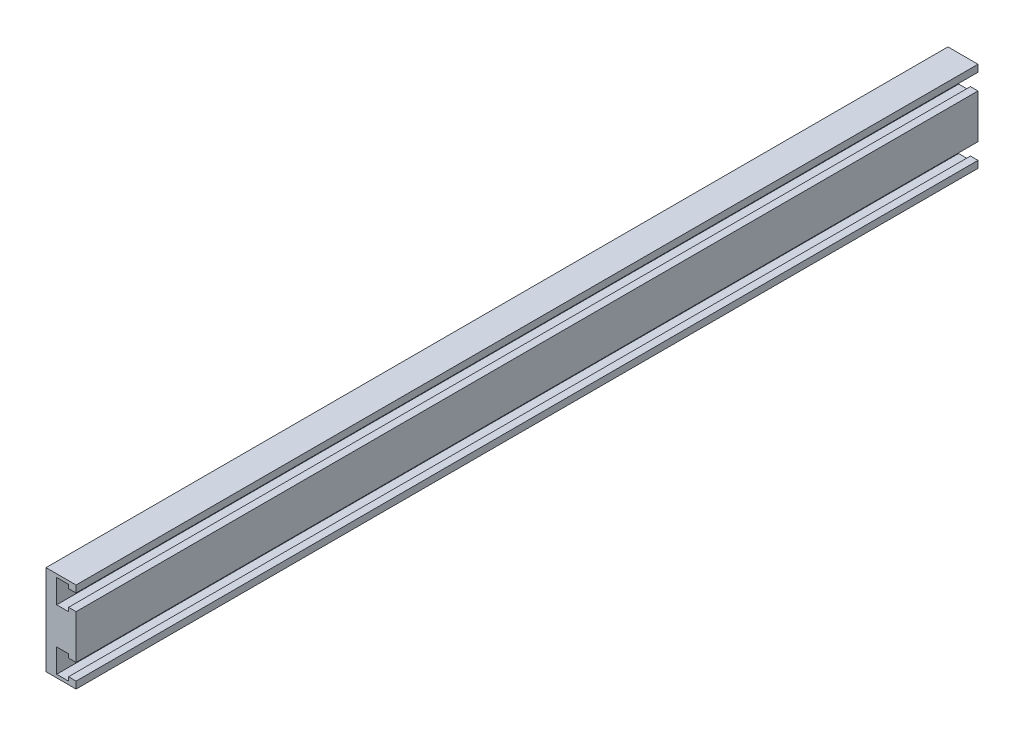
ISO-10303-21;
HEADER;
FILE_DESCRIPTION(('STEP AP214'),'2;1');
FILE_NAME('part.step','',(''),(''),'','','');
FILE_SCHEMA(('AUTOMOTIVE_DESIGN { 1 0 10303 214 1 1 1 1 }'));
ENDSEC;
DATA;
#1=APPLICATION_CONTEXT('core data for automotive mechanical design processes');
#2=APPLICATION_PROTOCOL_DEFINITION('international standard','automotive_design',2000,#1);
#3=PRODUCT_CONTEXT('',#1,'mechanical');
#4=PRODUCT('Part','Part','',(#3));
#5=PRODUCT_RELATED_PRODUCT_CATEGORY('part','',(#4));
#6=PRODUCT_DEFINITION_FORMATION('','',#4);
#7=PRODUCT_DEFINITION_CONTEXT('part definition',#1,'design');
#8=PRODUCT_DEFINITION('design','',#6,#7);
#9=PRODUCT_DEFINITION_SHAPE('','',#8);
#10=(LENGTH_UNIT() NAMED_UNIT(*) SI_UNIT(.MILLI.,.METRE.));
#11=(NAMED_UNIT(*) PLANE_ANGLE_UNIT() SI_UNIT($,.RADIAN.));
#12=(NAMED_UNIT(*) SI_UNIT($,.STERADIAN.) SOLID_ANGLE_UNIT());
#13=UNCERTAINTY_MEASURE_WITH_UNIT(LENGTH_MEASURE(1.E-05),#10,'distance_accuracy_value','');
#14=(GEOMETRIC_REPRESENTATION_CONTEXT(3) GLOBAL_UNCERTAINTY_ASSIGNED_CONTEXT((#13)) GLOBAL_UNIT_ASSIGNED_CONTEXT((#10,
#11,#12)) REPRESENTATION_CONTEXT('',''));
#15=CARTESIAN_POINT('',(0.,0.,0.));
#16=DIRECTION('',(0.,0.,1.));
#17=DIRECTION('',(1.,0.,0.));
#18=AXIS2_PLACEMENT_3D('',#15,#16,#17);
#19=CARTESIAN_POINT('',(-6.35,-19.05,-190.5));
#20=DIRECTION('',(0.,-1.,0.));
#21=DIRECTION('',(0.,0.,-1.));
#22=AXIS2_PLACEMENT_3D('',#19,#20,#21);
#23=PLANE('',#22);
#24=DIRECTION('',(0.,0.,1.));
#25=VECTOR('',#24,1.);
#26=CARTESIAN_POINT('',(6.35,-19.05,-190.5));
#27=LINE('',#26,#25);
#28=CARTESIAN_POINT('',(6.35,-19.05,-190.5));
#29=VERTEX_POINT('',#28);
#30=CARTESIAN_POINT('',(6.35,-19.05,190.5));
#31=VERTEX_POINT('',#30);
#32=EDGE_CURVE('E46',#29,#31,#27,.T.);
#33=ORIENTED_EDGE('',*,*,#32,.T.);
#34=DIRECTION('',(1.,0.,0.));
#35=VECTOR('',#34,1.);
#36=CARTESIAN_POINT('',(-6.35,-19.05,190.5));
#37=LINE('',#36,#35);
#38=CARTESIAN_POINT('',(-6.35,-19.05,190.5));
#39=VERTEX_POINT('',#38);
#40=EDGE_CURVE('E179',#39,#31,#37,.T.);
#41=ORIENTED_EDGE('',*,*,#40,.F.);
#42=DIRECTION('',(0.,0.,1.));
#43=VECTOR('',#42,1.);
#44=CARTESIAN_POINT('',(-6.35,-19.05,-190.5));
#45=LINE('',#44,#43);
#46=CARTESIAN_POINT('',(-6.35,-19.05,-190.5));
#47=VERTEX_POINT('',#46);
#48=EDGE_CURVE('E11',#47,#39,#45,.T.);
#49=ORIENTED_EDGE('',*,*,#48,.F.);
#50=DIRECTION('',(1.,0.,0.));
#51=VECTOR('',#50,1.);
#52=CARTESIAN_POINT('',(-6.35,-19.05,-190.5));
#53=LINE('',#52,#51);
#54=EDGE_CURVE('E181',#47,#29,#53,.T.);
#55=ORIENTED_EDGE('',*,*,#54,.T.);
#56=EDGE_LOOP('',(#33,#41,#49,#55));
#57=FACE_BOUND('',#56,.T.);
#58=ADVANCED_FACE('F43',(#57),#23,.T.);
#59=CARTESIAN_POINT('',(-6.35,-19.05,-190.5));
#60=DIRECTION('',(1.,0.,0.));
#61=DIRECTION('',(0.,0.,-1.));
#62=AXIS2_PLACEMENT_3D('',#59,#60,#61);
#63=PLANE('',#62);
#64=ORIENTED_EDGE('',*,*,#48,.T.);
#65=DIRECTION('',(0.,1.,0.));
#66=VECTOR('',#65,1.);
#67=CARTESIAN_POINT('',(-6.35,-19.05,190.5));
#68=LINE('',#67,#66);
#69=CARTESIAN_POINT('',(-6.35,19.05,190.5));
#70=VERTEX_POINT('',#69);
#71=EDGE_CURVE('E193',#39,#70,#68,.T.);
#72=ORIENTED_EDGE('',*,*,#71,.T.);
#73=DIRECTION('',(0.,0.,1.));
#74=VECTOR('',#73,1.);
#75=CARTESIAN_POINT('',(-6.35,19.05,-190.5));
#76=LINE('',#75,#74);
#77=CARTESIAN_POINT('',(-6.35,19.05,-190.5));
#78=VERTEX_POINT('',#77);
#79=EDGE_CURVE('E51',#78,#70,#76,.T.);
#80=ORIENTED_EDGE('',*,*,#79,.F.);
#81=DIRECTION('',(0.,1.,0.));
#82=VECTOR('',#81,1.);
#83=CARTESIAN_POINT('',(-6.35,-19.05,-190.5));
#84=LINE('',#83,#82);
#85=EDGE_CURVE('E64',#47,#78,#84,.T.);
#86=ORIENTED_EDGE('',*,*,#85,.F.);
#87=EDGE_LOOP('',(#64,#72,#80,#86));
#88=FACE_BOUND('',#87,.T.);
#89=ADVANCED_FACE('F404',(#88),#63,.F.);
#90=CARTESIAN_POINT('',(-6.35,19.05,-190.5));
#91=DIRECTION('',(0.,-1.,0.));
#92=DIRECTION('',(0.,0.,-1.));
#93=AXIS2_PLACEMENT_3D('',#90,#91,#92);
#94=PLANE('',#93);
#95=ORIENTED_EDGE('',*,*,#79,.T.);
#96=DIRECTION('',(1.,0.,0.));
#97=VECTOR('',#96,1.);
#98=CARTESIAN_POINT('',(-6.35,19.05,190.5));
#99=LINE('',#98,#97);
#100=CARTESIAN_POINT('',(6.35,19.05,190.5));
#101=VERTEX_POINT('',#100);
#102=EDGE_CURVE('E246',#70,#101,#99,.T.);
#103=ORIENTED_EDGE('',*,*,#102,.T.);
#104=DIRECTION('',(0.,0.,1.));
#105=VECTOR('',#104,1.);
#106=CARTESIAN_POINT('',(6.35,19.05,-190.5));
#107=LINE('',#106,#105);
#108=CARTESIAN_POINT('',(6.35,19.05,-190.5));
#109=VERTEX_POINT('',#108);
#110=EDGE_CURVE('E297',#109,#101,#107,.T.);
#111=ORIENTED_EDGE('',*,*,#110,.F.);
#112=DIRECTION('',(1.,0.,0.));
#113=VECTOR('',#112,1.);
#114=CARTESIAN_POINT('',(-6.35,19.05,-190.5));
#115=LINE('',#114,#113);
#116=EDGE_CURVE('E293',#78,#109,#115,.T.);
#117=ORIENTED_EDGE('',*,*,#116,.F.);
#118=EDGE_LOOP('',(#95,#103,#111,#117));
#119=FACE_BOUND('',#118,.T.);
#120=ADVANCED_FACE('F401',(#119),#94,.F.);
#121=CARTESIAN_POINT('',(6.35,16.1125,-190.5));
#122=DIRECTION('',(1.,0.,0.));
#123=DIRECTION('',(0.,1.,0.));
#124=AXIS2_PLACEMENT_3D('',#121,#122,#123);
#125=PLANE('',#124);
#126=ORIENTED_EDGE('',*,*,#110,.T.);
#127=DIRECTION('',(0.,1.,0.));
#128=VECTOR('',#127,1.);
#129=CARTESIAN_POINT('',(6.35,16.1125,190.5));
#130=LINE('',#129,#128);
#131=CARTESIAN_POINT('',(6.35,16.1125,190.5));
#132=VERTEX_POINT('',#131);
#133=EDGE_CURVE('E243',#132,#101,#130,.T.);
#134=ORIENTED_EDGE('',*,*,#133,.F.);
#135=DIRECTION('',(0.,0.,1.));
#136=VECTOR('',#135,1.);
#137=CARTESIAN_POINT('',(6.35,16.1125,-190.5));
#138=LINE('',#137,#136);
#139=CARTESIAN_POINT('',(6.35,16.1125,-190.5));
#140=VERTEX_POINT('',#139);
#141=EDGE_CURVE('E299',#140,#132,#138,.T.);
#142=ORIENTED_EDGE('',*,*,#141,.F.);
#143=DIRECTION('',(0.,1.,0.));
#144=VECTOR('',#143,1.);
#145=CARTESIAN_POINT('',(6.35,16.1125,-190.5));
#146=LINE('',#145,#144);
#147=EDGE_CURVE('E290',#140,#109,#146,.T.);
#148=ORIENTED_EDGE('',*,*,#147,.T.);
#149=EDGE_LOOP('',(#126,#134,#142,#148));
#150=FACE_BOUND('',#149,.T.);
#151=ADVANCED_FACE('F411',(#150),#125,.T.);
#152=CARTESIAN_POINT('',(6.35,16.1125,-190.5));
#153=DIRECTION('',(0.,1.,0.));
#154=DIRECTION('',(0.,0.,1.));
#155=AXIS2_PLACEMENT_3D('',#152,#153,#154);
#156=PLANE('',#155);
#157=ORIENTED_EDGE('',*,*,#141,.T.);
#158=DIRECTION('',(-1.,0.,0.));
#159=VECTOR('',#158,1.);
#160=CARTESIAN_POINT('',(6.35,16.1125,190.5));
#161=LINE('',#160,#159);
#162=CARTESIAN_POINT('',(3.175,16.1125,190.5));
#163=VERTEX_POINT('',#162);
#164=EDGE_CURVE('E240',#132,#163,#161,.T.);
#165=ORIENTED_EDGE('',*,*,#164,.T.);
#166=DIRECTION('',(0.,0.,1.));
#167=VECTOR('',#166,1.);
#168=CARTESIAN_POINT('',(3.175,16.1125,-190.5));
#169=LINE('',#168,#167);
#170=CARTESIAN_POINT('',(3.175,16.1125,-190.5));
#171=VERTEX_POINT('',#170);
#172=EDGE_CURVE('E301',#171,#163,#169,.T.);
#173=ORIENTED_EDGE('',*,*,#172,.F.);
#174=DIRECTION('',(-1.,0.,0.));
#175=VECTOR('',#174,1.);
#176=CARTESIAN_POINT('',(6.35,16.1125,-190.5));
#177=LINE('',#176,#175);
#178=EDGE_CURVE('E288',#140,#171,#177,.T.);
#179=ORIENTED_EDGE('',*,*,#178,.F.);
#180=EDGE_LOOP('',(#157,#165,#173,#179));
#181=FACE_BOUND('',#180,.T.);
#182=ADVANCED_FACE('F395',(#181),#156,.F.);
#183=CARTESIAN_POINT('',(3.175,16.1125,-190.5));
#184=DIRECTION('',(1.,0.,0.));
#185=DIRECTION('',(0.,0.,-1.));
#186=AXIS2_PLACEMENT_3D('',#183,#184,#185);
#187=PLANE('',#186);
#188=ORIENTED_EDGE('',*,*,#172,.T.);
#189=DIRECTION('',(0.,1.,0.));
#190=VECTOR('',#189,1.);
#191=CARTESIAN_POINT('',(3.175,16.1125,190.5));
#192=LINE('',#191,#190);
#193=CARTESIAN_POINT('',(3.175,17.7,190.5));
#194=VERTEX_POINT('',#193);
#195=EDGE_CURVE('E237',#163,#194,#192,.T.);
#196=ORIENTED_EDGE('',*,*,#195,.T.);
#197=DIRECTION('',(0.,0.,1.));
#198=VECTOR('',#197,1.);
#199=CARTESIAN_POINT('',(3.175,17.7,-190.5));
#200=LINE('',#199,#198);
#201=CARTESIAN_POINT('',(3.175,17.7,-190.5));
#202=VERTEX_POINT('',#201);
#203=EDGE_CURVE('E303',#202,#194,#200,.T.);
#204=ORIENTED_EDGE('',*,*,#203,.F.);
#205=DIRECTION('',(0.,1.,0.));
#206=VECTOR('',#205,1.);
#207=CARTESIAN_POINT('',(3.175,16.1125,-190.5));
#208=LINE('',#207,#206);
#209=EDGE_CURVE('E286',#171,#202,#208,.T.);
#210=ORIENTED_EDGE('',*,*,#209,.F.);
#211=EDGE_LOOP('',(#188,#196,#204,#210));
#212=FACE_BOUND('',#211,.T.);
#213=ADVANCED_FACE('F390',(#212),#187,.F.);
#214=CARTESIAN_POINT('',(3.175,17.7,-190.5));
#215=DIRECTION('',(0.,1.,0.));
#216=DIRECTION('',(0.,0.,1.));
#217=AXIS2_PLACEMENT_3D('',#214,#215,#216);
#218=PLANE('',#217);
#219=ORIENTED_EDGE('',*,*,#203,.T.);
#220=DIRECTION('',(-1.,0.,0.));
#221=VECTOR('',#220,1.);
#222=CARTESIAN_POINT('',(3.175,17.7,190.5));
#223=LINE('',#222,#221);
#224=CARTESIAN_POINT('',(-1.825,17.7,190.5));
#225=VERTEX_POINT('',#224);
#226=EDGE_CURVE('E234',#194,#225,#223,.T.);
#227=ORIENTED_EDGE('',*,*,#226,.T.);
#228=DIRECTION('',(0.,0.,1.));
#229=VECTOR('',#228,1.);
#230=CARTESIAN_POINT('',(-1.825,17.7,-190.5));
#231=LINE('',#230,#229);
#232=CARTESIAN_POINT('',(-1.825,17.7,-190.5));
#233=VERTEX_POINT('',#232);
#234=EDGE_CURVE('E305',#233,#225,#231,.T.);
#235=ORIENTED_EDGE('',*,*,#234,.F.);
#236=DIRECTION('',(-1.,0.,0.));
#237=VECTOR('',#236,1.);
#238=CARTESIAN_POINT('',(3.175,17.7,-190.5));
#239=LINE('',#238,#237);
#240=EDGE_CURVE('E284',#202,#233,#239,.T.);
#241=ORIENTED_EDGE('',*,*,#240,.F.);
#242=EDGE_LOOP('',(#219,#227,#235,#241));
#243=FACE_BOUND('',#242,.T.);
#244=ADVANCED_FACE('F385',(#243),#218,.F.);
#245=CARTESIAN_POINT('',(-1.825,17.7,-190.5));
#246=DIRECTION('',(-1.,0.,0.));
#247=DIRECTION('',(0.,0.,1.));
#248=AXIS2_PLACEMENT_3D('',#245,#246,#247);
#249=PLANE('',#248);
#250=ORIENTED_EDGE('',*,*,#234,.T.);
#251=DIRECTION('',(0.,-1.,0.));
#252=VECTOR('',#251,1.);
#253=CARTESIAN_POINT('',(-1.825,17.7,190.5));
#254=LINE('',#253,#252);
#255=CARTESIAN_POINT('',(-1.825,7.7,190.5));
#256=VERTEX_POINT('',#255);
#257=EDGE_CURVE('E231',#225,#256,#254,.T.);
#258=ORIENTED_EDGE('',*,*,#257,.T.);
#259=DIRECTION('',(0.,0.,1.));
#260=VECTOR('',#259,1.);
#261=CARTESIAN_POINT('',(-1.825,7.7,-190.5));
#262=LINE('',#261,#260);
#263=CARTESIAN_POINT('',(-1.825,7.7,-190.5));
#264=VERTEX_POINT('',#263);
#265=EDGE_CURVE('E307',#264,#256,#262,.T.);
#266=ORIENTED_EDGE('',*,*,#265,.F.);
#267=DIRECTION('',(0.,-1.,0.));
#268=VECTOR('',#267,1.);
#269=CARTESIAN_POINT('',(-1.825,17.7,-190.5));
#270=LINE('',#269,#268);
#271=EDGE_CURVE('E282',#233,#264,#270,.T.);
#272=ORIENTED_EDGE('',*,*,#271,.F.);
#273=EDGE_LOOP('',(#250,#258,#266,#272));
#274=FACE_BOUND('',#273,.T.);
#275=ADVANCED_FACE('F380',(#274),#249,.F.);
#276=CARTESIAN_POINT('',(-1.825,7.7,-190.5));
#277=DIRECTION('',(0.,-1.,0.));
#278=DIRECTION('',(0.,0.,-1.));
#279=AXIS2_PLACEMENT_3D('',#276,#277,#278);
#280=PLANE('',#279);
#281=ORIENTED_EDGE('',*,*,#265,.T.);
#282=DIRECTION('',(1.,0.,0.));
#283=VECTOR('',#282,1.);
#284=CARTESIAN_POINT('',(-1.825,7.7,190.5));
#285=LINE('',#284,#283);
#286=CARTESIAN_POINT('',(3.175,7.7,190.5));
#287=VERTEX_POINT('',#286);
#288=EDGE_CURVE('E228',#256,#287,#285,.T.);
#289=ORIENTED_EDGE('',*,*,#288,.T.);
#290=DIRECTION('',(0.,0.,1.));
#291=VECTOR('',#290,1.);
#292=CARTESIAN_POINT('',(3.175,7.7,-190.5));
#293=LINE('',#292,#291);
#294=CARTESIAN_POINT('',(3.175,7.7,-190.5));
#295=VERTEX_POINT('',#294);
#296=EDGE_CURVE('E309',#295,#287,#293,.T.);
#297=ORIENTED_EDGE('',*,*,#296,.F.);
#298=DIRECTION('',(1.,0.,0.));
#299=VECTOR('',#298,1.);
#300=CARTESIAN_POINT('',(-1.825,7.7,-190.5));
#301=LINE('',#300,#299);
#302=EDGE_CURVE('E280',#264,#295,#301,.T.);
#303=ORIENTED_EDGE('',*,*,#302,.F.);
#304=EDGE_LOOP('',(#281,#289,#297,#303));
#305=FACE_BOUND('',#304,.T.);
#306=ADVANCED_FACE('F375',(#305),#280,.F.);
#307=CARTESIAN_POINT('',(3.175,7.7,-190.5));
#308=DIRECTION('',(1.,0.,0.));
#309=DIRECTION('',(0.,0.,-1.));
#310=AXIS2_PLACEMENT_3D('',#307,#308,#309);
#311=PLANE('',#310);
#312=ORIENTED_EDGE('',*,*,#296,.T.);
#313=DIRECTION('',(0.,1.,0.));
#314=VECTOR('',#313,1.);
#315=CARTESIAN_POINT('',(3.175,7.7,190.5));
#316=LINE('',#315,#314);
#317=CARTESIAN_POINT('',(3.175,9.2875,190.5));
#318=VERTEX_POINT('',#317);
#319=EDGE_CURVE('E225',#287,#318,#316,.T.);
#320=ORIENTED_EDGE('',*,*,#319,.T.);
#321=DIRECTION('',(0.,0.,1.));
#322=VECTOR('',#321,1.);
#323=CARTESIAN_POINT('',(3.175,9.2875,-190.5));
#324=LINE('',#323,#322);
#325=CARTESIAN_POINT('',(3.175,9.2875,-190.5));
#326=VERTEX_POINT('',#325);
#327=EDGE_CURVE('E311',#326,#318,#324,.T.);
#328=ORIENTED_EDGE('',*,*,#327,.F.);
#329=DIRECTION('',(0.,1.,0.));
#330=VECTOR('',#329,1.);
#331=CARTESIAN_POINT('',(3.175,7.7,-190.5));
#332=LINE('',#331,#330);
#333=EDGE_CURVE('E278',#295,#326,#332,.T.);
#334=ORIENTED_EDGE('',*,*,#333,.F.);
#335=EDGE_LOOP('',(#312,#320,#328,#334));
#336=FACE_BOUND('',#335,.T.);
#337=ADVANCED_FACE('F370',(#336),#311,.F.);
#338=CARTESIAN_POINT('',(3.175,9.2875,-190.5));
#339=DIRECTION('',(0.,-1.,0.));
#340=DIRECTION('',(0.,0.,-1.));
#341=AXIS2_PLACEMENT_3D('',#338,#339,#340);
#342=PLANE('',#341);
#343=ORIENTED_EDGE('',*,*,#327,.T.);
#344=DIRECTION('',(1.,0.,0.));
#345=VECTOR('',#344,1.);
#346=CARTESIAN_POINT('',(3.175,9.2875,190.5));
#347=LINE('',#346,#345);
#348=CARTESIAN_POINT('',(6.34999999999999,9.2875,190.5));
#349=VERTEX_POINT('',#348);
#350=EDGE_CURVE('E222',#318,#349,#347,.T.);
#351=ORIENTED_EDGE('',*,*,#350,.T.);
#352=DIRECTION('',(0.,0.,1.));
#353=VECTOR('',#352,1.);
#354=CARTESIAN_POINT('',(6.34999999999999,9.2875,-190.5));
#355=LINE('',#354,#353);
#356=CARTESIAN_POINT('',(6.34999999999999,9.2875,-190.5));
#357=VERTEX_POINT('',#356);
#358=EDGE_CURVE('E313',#357,#349,#355,.T.);
#359=ORIENTED_EDGE('',*,*,#358,.F.);
#360=DIRECTION('',(1.,0.,0.));
#361=VECTOR('',#360,1.);
#362=CARTESIAN_POINT('',(3.175,9.2875,-190.5));
#363=LINE('',#362,#361);
#364=EDGE_CURVE('E276',#326,#357,#363,.T.);
#365=ORIENTED_EDGE('',*,*,#364,.F.);
#366=EDGE_LOOP('',(#343,#351,#359,#365));
#367=FACE_BOUND('',#366,.T.);
#368=ADVANCED_FACE('F365',(#367),#342,.F.);
#369=CARTESIAN_POINT('',(6.34999999999999,9.2875,-190.5));
#370=DIRECTION('',(-1.,0.,0.));
#371=DIRECTION('',(0.,0.,1.));
#372=AXIS2_PLACEMENT_3D('',#369,#370,#371);
#373=PLANE('',#372);
#374=ORIENTED_EDGE('',*,*,#358,.T.);
#375=DIRECTION('',(0.,-1.,0.));
#376=VECTOR('',#375,1.);
#377=CARTESIAN_POINT('',(6.34999999999999,9.2875,190.5));
#378=LINE('',#377,#376);
#379=CARTESIAN_POINT('',(6.34999999999999,-9.2875,190.5));
#380=VERTEX_POINT('',#379);
#381=EDGE_CURVE('E219',#349,#380,#378,.T.);
#382=ORIENTED_EDGE('',*,*,#381,.T.);
#383=DIRECTION('',(0.,0.,1.));
#384=VECTOR('',#383,1.);
#385=CARTESIAN_POINT('',(6.34999999999999,-9.2875,-190.5));
#386=LINE('',#385,#384);
#387=CARTESIAN_POINT('',(6.34999999999999,-9.2875,-190.5));
#388=VERTEX_POINT('',#387);
#389=EDGE_CURVE('E315',#388,#380,#386,.T.);
#390=ORIENTED_EDGE('',*,*,#389,.F.);
#391=DIRECTION('',(0.,-1.,0.));
#392=VECTOR('',#391,1.);
#393=CARTESIAN_POINT('',(6.34999999999999,9.2875,-190.5));
#394=LINE('',#393,#392);
#395=EDGE_CURVE('E274',#357,#388,#394,.T.);
#396=ORIENTED_EDGE('',*,*,#395,.F.);
#397=EDGE_LOOP('',(#374,#382,#390,#396));
#398=FACE_BOUND('',#397,.T.);
#399=ADVANCED_FACE('F361',(#398),#373,.F.);
#400=CARTESIAN_POINT('',(3.175,-9.2875,-190.5));
#401=DIRECTION('',(0.,-1.,0.));
#402=DIRECTION('',(0.,0.,-1.));
#403=AXIS2_PLACEMENT_3D('',#400,#401,#402);
#404=PLANE('',#403);
#405=ORIENTED_EDGE('',*,*,#389,.T.);
#406=DIRECTION('',(1.,0.,0.));
#407=VECTOR('',#406,1.);
#408=CARTESIAN_POINT('',(3.175,-9.2875,190.5));
#409=LINE('',#408,#407);
#410=CARTESIAN_POINT('',(3.175,-9.2875,190.5));
#411=VERTEX_POINT('',#410);
#412=EDGE_CURVE('E216',#411,#380,#409,.T.);
#413=ORIENTED_EDGE('',*,*,#412,.F.);
#414=DIRECTION('',(0.,0.,1.));
#415=VECTOR('',#414,1.);
#416=CARTESIAN_POINT('',(3.175,-9.2875,-190.5));
#417=LINE('',#416,#415);
#418=CARTESIAN_POINT('',(3.175,-9.2875,-190.5));
#419=VERTEX_POINT('',#418);
#420=EDGE_CURVE('E317',#419,#411,#417,.T.);
#421=ORIENTED_EDGE('',*,*,#420,.F.);
#422=DIRECTION('',(1.,0.,0.));
#423=VECTOR('',#422,1.);
#424=CARTESIAN_POINT('',(3.175,-9.2875,-190.5));
#425=LINE('',#424,#423);
#426=EDGE_CURVE('E271',#419,#388,#425,.T.);
#427=ORIENTED_EDGE('',*,*,#426,.T.);
#428=EDGE_LOOP('',(#405,#413,#421,#427));
#429=FACE_BOUND('',#428,.T.);
#430=ADVANCED_FACE('F356',(#429),#404,.T.);
#431=CARTESIAN_POINT('',(3.175,-7.7,-190.5));
#432=DIRECTION('',(-1.,0.,0.));
#433=DIRECTION('',(0.,0.,1.));
#434=AXIS2_PLACEMENT_3D('',#431,#432,#433);
#435=PLANE('',#434);
#436=ORIENTED_EDGE('',*,*,#420,.T.);
#437=DIRECTION('',(0.,-1.,0.));
#438=VECTOR('',#437,1.);
#439=CARTESIAN_POINT('',(3.175,-7.7,190.5));
#440=LINE('',#439,#438);
#441=CARTESIAN_POINT('',(3.175,-7.7,190.5));
#442=VERTEX_POINT('',#441);
#443=EDGE_CURVE('E213',#442,#411,#440,.T.);
#444=ORIENTED_EDGE('',*,*,#443,.F.);
#445=DIRECTION('',(0.,0.,1.));
#446=VECTOR('',#445,1.);
#447=CARTESIAN_POINT('',(3.175,-7.7,-190.5));
#448=LINE('',#447,#446);
#449=CARTESIAN_POINT('',(3.175,-7.7,-190.5));
#450=VERTEX_POINT('',#449);
#451=EDGE_CURVE('E319',#450,#442,#448,.T.);
#452=ORIENTED_EDGE('',*,*,#451,.F.);
#453=DIRECTION('',(0.,-1.,0.));
#454=VECTOR('',#453,1.);
#455=CARTESIAN_POINT('',(3.175,-7.7,-190.5));
#456=LINE('',#455,#454);
#457=EDGE_CURVE('E268',#450,#419,#456,.T.);
#458=ORIENTED_EDGE('',*,*,#457,.T.);
#459=EDGE_LOOP('',(#436,#444,#452,#458));
#460=FACE_BOUND('',#459,.T.);
#461=ADVANCED_FACE('F351',(#460),#435,.T.);
#462=CARTESIAN_POINT('',(-1.825,-7.7,-190.5));
#463=DIRECTION('',(0.,-1.,0.));
#464=DIRECTION('',(1.,0.,0.));
#465=AXIS2_PLACEMENT_3D('',#462,#463,#464);
#466=PLANE('',#465);
#467=ORIENTED_EDGE('',*,*,#451,.T.);
#468=DIRECTION('',(1.,0.,0.));
#469=VECTOR('',#468,1.);
#470=CARTESIAN_POINT('',(-1.825,-7.7,190.5));
#471=LINE('',#470,#469);
#472=CARTESIAN_POINT('',(-1.825,-7.7,190.5));
#473=VERTEX_POINT('',#472);
#474=EDGE_CURVE('E210',#473,#442,#471,.T.);
#475=ORIENTED_EDGE('',*,*,#474,.F.);
#476=DIRECTION('',(0.,0.,1.));
#477=VECTOR('',#476,1.);
#478=CARTESIAN_POINT('',(-1.825,-7.7,-190.5));
#479=LINE('',#478,#477);
#480=CARTESIAN_POINT('',(-1.825,-7.7,-190.5));
#481=VERTEX_POINT('',#480);
#482=EDGE_CURVE('E321',#481,#473,#479,.T.);
#483=ORIENTED_EDGE('',*,*,#482,.F.);
#484=DIRECTION('',(1.,0.,0.));
#485=VECTOR('',#484,1.);
#486=CARTESIAN_POINT('',(-1.825,-7.7,-190.5));
#487=LINE('',#486,#485);
#488=EDGE_CURVE('E265',#481,#450,#487,.T.);
#489=ORIENTED_EDGE('',*,*,#488,.T.);
#490=EDGE_LOOP('',(#467,#475,#483,#489));
#491=FACE_BOUND('',#490,.T.);
#492=ADVANCED_FACE('F349',(#491),#466,.T.);
#493=CARTESIAN_POINT('',(-1.825,-17.7,-190.5));
#494=DIRECTION('',(1.,0.,0.));
#495=DIRECTION('',(0.,0.,-1.));
#496=AXIS2_PLACEMENT_3D('',#493,#494,#495);
#497=PLANE('',#496);
#498=ORIENTED_EDGE('',*,*,#482,.T.);
#499=DIRECTION('',(0.,1.,0.));
#500=VECTOR('',#499,1.);
#501=CARTESIAN_POINT('',(-1.825,-17.7,190.5));
#502=LINE('',#501,#500);
#503=CARTESIAN_POINT('',(-1.825,-17.7,190.5));
#504=VERTEX_POINT('',#503);
#505=EDGE_CURVE('E207',#504,#473,#502,.T.);
#506=ORIENTED_EDGE('',*,*,#505,.F.);
#507=DIRECTION('',(0.,0.,1.));
#508=VECTOR('',#507,1.);
#509=CARTESIAN_POINT('',(-1.825,-17.7,-190.5));
#510=LINE('',#509,#508);
#511=CARTESIAN_POINT('',(-1.825,-17.7,-190.5));
#512=VERTEX_POINT('',#511);
#513=EDGE_CURVE('E323',#512,#504,#510,.T.);
#514=ORIENTED_EDGE('',*,*,#513,.F.);
#515=DIRECTION('',(0.,1.,0.));
#516=VECTOR('',#515,1.);
#517=CARTESIAN_POINT('',(-1.825,-17.7,-190.5));
#518=LINE('',#517,#516);
#519=EDGE_CURVE('E262',#512,#481,#518,.T.);
#520=ORIENTED_EDGE('',*,*,#519,.T.);
#521=EDGE_LOOP('',(#498,#506,#514,#520));
#522=FACE_BOUND('',#521,.T.);
#523=ADVANCED_FACE('F344',(#522),#497,.T.);
#524=CARTESIAN_POINT('',(3.175,-17.7,-190.5));
#525=DIRECTION('',(0.,1.,0.));
#526=DIRECTION('',(0.,0.,1.));
#527=AXIS2_PLACEMENT_3D('',#524,#525,#526);
#528=PLANE('',#527);
#529=ORIENTED_EDGE('',*,*,#513,.T.);
#530=DIRECTION('',(-1.,0.,0.));
#531=VECTOR('',#530,1.);
#532=CARTESIAN_POINT('',(3.175,-17.7,190.5));
#533=LINE('',#532,#531);
#534=CARTESIAN_POINT('',(3.175,-17.7,190.5));
#535=VERTEX_POINT('',#534);
#536=EDGE_CURVE('E204',#535,#504,#533,.T.);
#537=ORIENTED_EDGE('',*,*,#536,.F.);
#538=DIRECTION('',(0.,0.,1.));
#539=VECTOR('',#538,1.);
#540=CARTESIAN_POINT('',(3.175,-17.7,-190.5));
#541=LINE('',#540,#539);
#542=CARTESIAN_POINT('',(3.175,-17.7,-190.5));
#543=VERTEX_POINT('',#542);
#544=EDGE_CURVE('E325',#543,#535,#541,.T.);
#545=ORIENTED_EDGE('',*,*,#544,.F.);
#546=DIRECTION('',(-1.,0.,0.));
#547=VECTOR('',#546,1.);
#548=CARTESIAN_POINT('',(3.175,-17.7,-190.5));
#549=LINE('',#548,#547);
#550=EDGE_CURVE('E259',#543,#512,#549,.T.);
#551=ORIENTED_EDGE('',*,*,#550,.T.);
#552=EDGE_LOOP('',(#529,#537,#545,#551));
#553=FACE_BOUND('',#552,.T.);
#554=ADVANCED_FACE('F338',(#553),#528,.T.);
#555=CARTESIAN_POINT('',(3.175,-16.1125,-190.5));
#556=DIRECTION('',(-1.,0.,0.));
#557=DIRECTION('',(0.,0.,1.));
#558=AXIS2_PLACEMENT_3D('',#555,#556,#557);
#559=PLANE('',#558);
#560=ORIENTED_EDGE('',*,*,#544,.T.);
#561=DIRECTION('',(0.,-1.,0.));
#562=VECTOR('',#561,1.);
#563=CARTESIAN_POINT('',(3.175,-16.1125,190.5));
#564=LINE('',#563,#562);
#565=CARTESIAN_POINT('',(3.175,-16.1125,190.5));
#566=VERTEX_POINT('',#565);
#567=EDGE_CURVE('E199',#566,#535,#564,.T.);
#568=ORIENTED_EDGE('',*,*,#567,.F.);
#569=DIRECTION('',(0.,0.,1.));
#570=VECTOR('',#569,1.);
#571=CARTESIAN_POINT('',(3.175,-16.1125,-190.5));
#572=LINE('',#571,#570);
#573=CARTESIAN_POINT('',(3.175,-16.1125,-190.5));
#574=VERTEX_POINT('',#573);
#575=EDGE_CURVE('E327',#574,#566,#572,.T.);
#576=ORIENTED_EDGE('',*,*,#575,.F.);
#577=DIRECTION('',(0.,-1.,0.));
#578=VECTOR('',#577,1.);
#579=CARTESIAN_POINT('',(3.175,-16.1125,-190.5));
#580=LINE('',#579,#578);
#581=EDGE_CURVE('E256',#574,#543,#580,.T.);
#582=ORIENTED_EDGE('',*,*,#581,.T.);
#583=EDGE_LOOP('',(#560,#568,#576,#582));
#584=FACE_BOUND('',#583,.T.);
#585=ADVANCED_FACE('F335',(#584),#559,.T.);
#586=CARTESIAN_POINT('',(6.35,-16.1125,-190.5));
#587=DIRECTION('',(0.,1.,0.));
#588=DIRECTION('',(0.,0.,1.));
#589=AXIS2_PLACEMENT_3D('',#586,#587,#588);
#590=PLANE('',#589);
#591=ORIENTED_EDGE('',*,*,#575,.T.);
#592=DIRECTION('',(-1.,0.,0.));
#593=VECTOR('',#592,1.);
#594=CARTESIAN_POINT('',(6.35,-16.1125,190.5));
#595=LINE('',#594,#593);
#596=CARTESIAN_POINT('',(6.35,-16.1125,190.5));
#597=VERTEX_POINT('',#596);
#598=EDGE_CURVE('E197',#597,#566,#595,.T.);
#599=ORIENTED_EDGE('',*,*,#598,.F.);
#600=DIRECTION('',(0.,0.,1.));
#601=VECTOR('',#600,1.);
#602=CARTESIAN_POINT('',(6.35,-16.1125,-190.5));
#603=LINE('',#602,#601);
#604=CARTESIAN_POINT('',(6.35,-16.1125,-190.5));
#605=VERTEX_POINT('',#604);
#606=EDGE_CURVE('E185',#605,#597,#603,.T.);
#607=ORIENTED_EDGE('',*,*,#606,.F.);
#608=DIRECTION('',(-1.,0.,0.));
#609=VECTOR('',#608,1.);
#610=CARTESIAN_POINT('',(6.35,-16.1125,-190.5));
#611=LINE('',#610,#609);
#612=EDGE_CURVE('E253',#605,#574,#611,.T.);
#613=ORIENTED_EDGE('',*,*,#612,.T.);
#614=EDGE_LOOP('',(#591,#599,#607,#613));
#615=FACE_BOUND('',#614,.T.);
#616=ADVANCED_FACE('F329',(#615),#590,.T.);
#617=CARTESIAN_POINT('',(6.35,-16.1125,-190.5));
#618=DIRECTION('',(-1.,0.,0.));
#619=DIRECTION('',(0.,-1.,0.));
#620=AXIS2_PLACEMENT_3D('',#617,#618,#619);
#621=PLANE('',#620);
#622=ORIENTED_EDGE('',*,*,#606,.T.);
#623=DIRECTION('',(0.,-1.,0.));
#624=VECTOR('',#623,1.);
#625=CARTESIAN_POINT('',(6.35,-16.1125,190.5));
#626=LINE('',#625,#624);
#627=EDGE_CURVE('E190',#597,#31,#626,.T.);
#628=ORIENTED_EDGE('',*,*,#627,.T.);
#629=ORIENTED_EDGE('',*,*,#32,.F.);
#630=DIRECTION('',(0.,-1.,0.));
#631=VECTOR('',#630,1.);
#632=CARTESIAN_POINT('',(6.35,-16.1125,-190.5));
#633=LINE('',#632,#631);
#634=EDGE_CURVE('E251',#605,#29,#633,.T.);
#635=ORIENTED_EDGE('',*,*,#634,.F.);
#636=EDGE_LOOP('',(#622,#628,#629,#635));
#637=FACE_BOUND('',#636,.T.);
#638=ADVANCED_FACE('F195',(#637),#621,.F.);
#639=CARTESIAN_POINT('',(0.,0.,-190.5));
#640=DIRECTION('',(0.,0.,-1.));
#641=DIRECTION('',(-1.,0.,0.));
#642=AXIS2_PLACEMENT_3D('',#639,#640,#641);
#643=PLANE('',#642);
#644=ORIENTED_EDGE('',*,*,#54,.F.);
#645=ORIENTED_EDGE('',*,*,#85,.T.);
#646=ORIENTED_EDGE('',*,*,#116,.T.);
#647=ORIENTED_EDGE('',*,*,#147,.F.);
#648=ORIENTED_EDGE('',*,*,#178,.T.);
#649=ORIENTED_EDGE('',*,*,#209,.T.);
#650=ORIENTED_EDGE('',*,*,#240,.T.);
#651=ORIENTED_EDGE('',*,*,#271,.T.);
#652=ORIENTED_EDGE('',*,*,#302,.T.);
#653=ORIENTED_EDGE('',*,*,#333,.T.);
#654=ORIENTED_EDGE('',*,*,#364,.T.);
#655=ORIENTED_EDGE('',*,*,#395,.T.);
#656=ORIENTED_EDGE('',*,*,#426,.F.);
#657=ORIENTED_EDGE('',*,*,#457,.F.);
#658=ORIENTED_EDGE('',*,*,#488,.F.);
#659=ORIENTED_EDGE('',*,*,#519,.F.);
#660=ORIENTED_EDGE('',*,*,#550,.F.);
#661=ORIENTED_EDGE('',*,*,#581,.F.);
#662=ORIENTED_EDGE('',*,*,#612,.F.);
#663=ORIENTED_EDGE('',*,*,#634,.T.);
#664=EDGE_LOOP('',(#644,#645,#646,#647,#648,#649,#650,#651,#652,#653,#654,#655,#656,#657,#658,
#659,#660,#661,#662,#663));
#665=FACE_BOUND('',#664,.T.);
#666=ADVANCED_FACE('F340',(#665),#643,.T.);
#667=CARTESIAN_POINT('',(0.,0.,190.5));
#668=DIRECTION('',(0.,0.,-1.));
#669=DIRECTION('',(-1.,0.,0.));
#670=AXIS2_PLACEMENT_3D('',#667,#668,#669);
#671=PLANE('',#670);
#672=ORIENTED_EDGE('',*,*,#40,.T.);
#673=ORIENTED_EDGE('',*,*,#627,.F.);
#674=ORIENTED_EDGE('',*,*,#598,.T.);
#675=ORIENTED_EDGE('',*,*,#567,.T.);
#676=ORIENTED_EDGE('',*,*,#536,.T.);
#677=ORIENTED_EDGE('',*,*,#505,.T.);
#678=ORIENTED_EDGE('',*,*,#474,.T.);
#679=ORIENTED_EDGE('',*,*,#443,.T.);
#680=ORIENTED_EDGE('',*,*,#412,.T.);
#681=ORIENTED_EDGE('',*,*,#381,.F.);
#682=ORIENTED_EDGE('',*,*,#350,.F.);
#683=ORIENTED_EDGE('',*,*,#319,.F.);
#684=ORIENTED_EDGE('',*,*,#288,.F.);
#685=ORIENTED_EDGE('',*,*,#257,.F.);
#686=ORIENTED_EDGE('',*,*,#226,.F.);
#687=ORIENTED_EDGE('',*,*,#195,.F.);
#688=ORIENTED_EDGE('',*,*,#164,.F.);
#689=ORIENTED_EDGE('',*,*,#133,.T.);
#690=ORIENTED_EDGE('',*,*,#102,.F.);
#691=ORIENTED_EDGE('',*,*,#71,.F.);
#692=EDGE_LOOP('',(#672,#673,#674,#675,#676,#677,#678,#679,#680,#681,#682,#683,#684,#685,#686,
#687,#688,#689,#690,#691));
#693=FACE_BOUND('',#692,.T.);
#694=ADVANCED_FACE('F188',(#693),#671,.F.);
#695=CLOSED_SHELL('',(#58,#89,#120,#151,#182,#213,#244,#275,#306,#337,#368,#399,#430,#461,#492,
#523,#554,#585,#616,#638,#666,#694));
#696=MANIFOLD_SOLID_BREP('B2',#695);
#697=ADVANCED_BREP_SHAPE_REPRESENTATION('',(#18,#696),#14);
#698=SHAPE_DEFINITION_REPRESENTATION(#9,#697);
ENDSEC;
END-ISO-10303-21;
